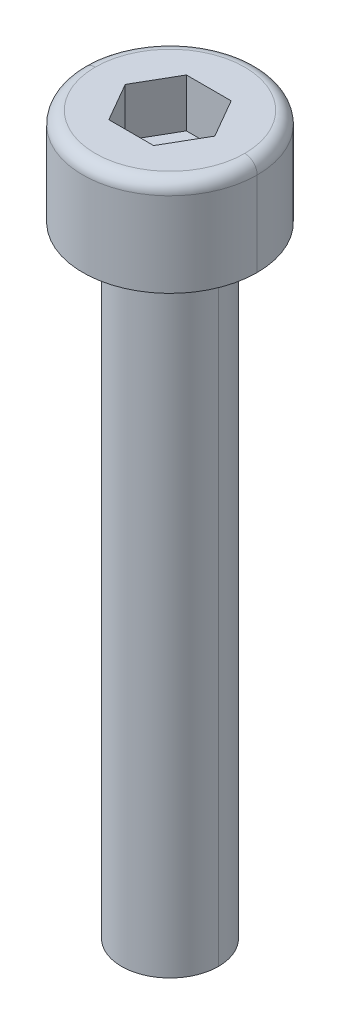
ISO-10303-21;
HEADER;
FILE_DESCRIPTION(('STEP AP214'),'2;1');
FILE_NAME('part.step','',(''),(''),'','','');
FILE_SCHEMA(('AUTOMOTIVE_DESIGN { 1 0 10303 214 1 1 1 1 }'));
ENDSEC;
DATA;
#1=APPLICATION_CONTEXT('core data for automotive mechanical design processes');
#2=APPLICATION_PROTOCOL_DEFINITION('international standard','automotive_design',2000,#1);
#3=PRODUCT_CONTEXT('',#1,'mechanical');
#4=PRODUCT('Part','Part','',(#3));
#5=PRODUCT_RELATED_PRODUCT_CATEGORY('part','',(#4));
#6=PRODUCT_DEFINITION_FORMATION('','',#4);
#7=PRODUCT_DEFINITION_CONTEXT('part definition',#1,'design');
#8=PRODUCT_DEFINITION('design','',#6,#7);
#9=PRODUCT_DEFINITION_SHAPE('','',#8);
#10=(LENGTH_UNIT() NAMED_UNIT(*) SI_UNIT(.MILLI.,.METRE.));
#11=(NAMED_UNIT(*) PLANE_ANGLE_UNIT() SI_UNIT($,.RADIAN.));
#12=(NAMED_UNIT(*) SI_UNIT($,.STERADIAN.) SOLID_ANGLE_UNIT());
#13=UNCERTAINTY_MEASURE_WITH_UNIT(LENGTH_MEASURE(1.E-05),#10,'distance_accuracy_value','');
#14=(GEOMETRIC_REPRESENTATION_CONTEXT(3) GLOBAL_UNCERTAINTY_ASSIGNED_CONTEXT((#13)) GLOBAL_UNIT_ASSIGNED_CONTEXT((#10,
#11,#12)) REPRESENTATION_CONTEXT('',''));
#15=CARTESIAN_POINT('',(0.,0.,0.));
#16=DIRECTION('',(0.,0.,1.));
#17=DIRECTION('',(1.,0.,0.));
#18=AXIS2_PLACEMENT_3D('',#15,#16,#17);
#19=CARTESIAN_POINT('',(0.,-16.,0.));
#20=DIRECTION('',(0.,1.,0.));
#21=DIRECTION('',(1.,0.,0.));
#22=AXIS2_PLACEMENT_3D('',#19,#20,#21);
#23=PLANE('',#22);
#24=CARTESIAN_POINT('',(0.,-16.,0.));
#25=DIRECTION('',(0.,1.,0.));
#26=DIRECTION('',(-1.,0.,0.));
#27=AXIS2_PLACEMENT_3D('',#24,#25,#26);
#28=CIRCLE('',#27,1.25);
#29=CARTESIAN_POINT('',(-1.25,-16.,0.));
#30=VERTEX_POINT('',#29);
#31=CARTESIAN_POINT('',(1.25,-16.,0.));
#32=VERTEX_POINT('',#31);
#33=EDGE_CURVE('E11',#30,#32,#28,.T.);
#34=ORIENTED_EDGE('',*,*,#33,.F.);
#35=CARTESIAN_POINT('',(0.,-16.,0.));
#36=DIRECTION('',(0.,1.,0.));
#37=DIRECTION('',(1.,0.,0.));
#38=AXIS2_PLACEMENT_3D('',#35,#36,#37);
#39=CIRCLE('',#38,1.25);
#40=EDGE_CURVE('E223',#32,#30,#39,.T.);
#41=ORIENTED_EDGE('',*,*,#40,.F.);
#42=EDGE_LOOP('',(#34,#41));
#43=FACE_BOUND('',#42,.T.);
#44=ADVANCED_FACE('F17',(#43),#23,.F.);
#45=CARTESIAN_POINT('',(0.,0.,0.));
#46=DIRECTION('',(0.,1.,0.));
#47=DIRECTION('',(1.,0.,0.));
#48=AXIS2_PLACEMENT_3D('',#45,#46,#47);
#49=CYLINDRICAL_SURFACE('',#48,1.25);
#50=DIRECTION('',(0.,-1.,0.));
#51=VECTOR('',#50,1.);
#52=CARTESIAN_POINT('',(-1.25,0.,0.));
#53=LINE('',#52,#51);
#54=CARTESIAN_POINT('',(-1.25,0.,0.));
#55=VERTEX_POINT('',#54);
#56=EDGE_CURVE('E28',#55,#30,#53,.T.);
#57=ORIENTED_EDGE('',*,*,#56,.T.);
#58=ORIENTED_EDGE('',*,*,#33,.T.);
#59=DIRECTION('',(0.,-1.,0.));
#60=VECTOR('',#59,1.);
#61=CARTESIAN_POINT('',(1.25,0.,0.));
#62=LINE('',#61,#60);
#63=CARTESIAN_POINT('',(1.25,0.,0.));
#64=VERTEX_POINT('',#63);
#65=EDGE_CURVE('E21',#64,#32,#62,.T.);
#66=ORIENTED_EDGE('',*,*,#65,.F.);
#67=CARTESIAN_POINT('',(0.,0.,0.));
#68=DIRECTION('',(0.,1.,0.));
#69=DIRECTION('',(-1.,0.,0.));
#70=AXIS2_PLACEMENT_3D('',#67,#68,#69);
#71=CIRCLE('',#70,1.25);
#72=EDGE_CURVE('E204',#55,#64,#71,.T.);
#73=ORIENTED_EDGE('',*,*,#72,.F.);
#74=EDGE_LOOP('',(#57,#58,#66,#73));
#75=FACE_BOUND('',#74,.T.);
#76=ADVANCED_FACE('F301',(#75),#49,.T.);
#77=CARTESIAN_POINT('',(0.,0.,0.));
#78=DIRECTION('',(0.,1.,0.));
#79=DIRECTION('',(1.,0.,0.));
#80=AXIS2_PLACEMENT_3D('',#77,#78,#79);
#81=CYLINDRICAL_SURFACE('',#80,1.25);
#82=ORIENTED_EDGE('',*,*,#65,.T.);
#83=ORIENTED_EDGE('',*,*,#40,.T.);
#84=ORIENTED_EDGE('',*,*,#56,.F.);
#85=CARTESIAN_POINT('',(0.,0.,0.));
#86=DIRECTION('',(0.,1.,0.));
#87=DIRECTION('',(1.,0.,0.));
#88=AXIS2_PLACEMENT_3D('',#85,#86,#87);
#89=CIRCLE('',#88,1.25);
#90=EDGE_CURVE('E154',#64,#55,#89,.T.);
#91=ORIENTED_EDGE('',*,*,#90,.F.);
#92=EDGE_LOOP('',(#82,#83,#84,#91));
#93=FACE_BOUND('',#92,.T.);
#94=ADVANCED_FACE('F306',(#93),#81,.T.);
#95=CARTESIAN_POINT('',(0.,0.,0.));
#96=DIRECTION('',(0.,1.,0.));
#97=DIRECTION('',(1.,0.,0.));
#98=AXIS2_PLACEMENT_3D('',#95,#96,#97);
#99=CYLINDRICAL_SURFACE('',#98,2.25);
#100=DIRECTION('',(0.,1.,-1.413161317912E-12));
#101=VECTOR('',#100,1.);
#102=CARTESIAN_POINT('',(-2.25,0.,0.));
#103=LINE('',#102,#101);
#104=CARTESIAN_POINT('',(-2.25,0.,0.));
#105=VERTEX_POINT('',#104);
#106=CARTESIAN_POINT('',(-2.25,2.178571428571,0.));
#107=VERTEX_POINT('',#106);
#108=EDGE_CURVE('E228',#105,#107,#103,.T.);
#109=ORIENTED_EDGE('',*,*,#108,.F.);
#110=CARTESIAN_POINT('',(0.,0.,0.));
#111=DIRECTION('',(0.,1.,0.));
#112=DIRECTION('',(-1.,0.,0.));
#113=AXIS2_PLACEMENT_3D('',#110,#111,#112);
#114=CIRCLE('',#113,2.25);
#115=CARTESIAN_POINT('',(2.25,0.,0.));
#116=VERTEX_POINT('',#115);
#117=EDGE_CURVE('E194',#105,#116,#114,.T.);
#118=ORIENTED_EDGE('',*,*,#117,.T.);
#119=DIRECTION('',(0.,1.,1.413056776317E-12));
#120=VECTOR('',#119,1.);
#121=CARTESIAN_POINT('',(2.25,0.,0.));
#122=LINE('',#121,#120);
#123=CARTESIAN_POINT('',(2.25,2.178571428571,0.));
#124=VERTEX_POINT('',#123);
#125=EDGE_CURVE('E232',#116,#124,#122,.T.);
#126=ORIENTED_EDGE('',*,*,#125,.T.);
#127=CARTESIAN_POINT('',(0.,2.178571428571,0.));
#128=DIRECTION('',(0.,1.,0.));
#129=DIRECTION('',(-1.,0.,0.));
#130=AXIS2_PLACEMENT_3D('',#127,#128,#129);
#131=CIRCLE('',#130,2.25);
#132=EDGE_CURVE('E129',#107,#124,#131,.T.);
#133=ORIENTED_EDGE('',*,*,#132,.F.);
#134=EDGE_LOOP('',(#109,#118,#126,#133));
#135=FACE_BOUND('',#134,.T.);
#136=ADVANCED_FACE('F286',(#135),#99,.T.);
#137=CARTESIAN_POINT('',(0.,2.178571428571,0.));
#138=DIRECTION('',(0.,1.,0.));
#139=DIRECTION('',(-0.999910626063819,0.,-0.0133693636595902));
#140=AXIS2_PLACEMENT_3D('',#137,#138,#139);
#141=TOROIDAL_SURFACE('',#140,1.928571428571,0.3214285714286);
#142=CARTESIAN_POINT('',(-1.928571428571,2.178571428571,0.));
#143=DIRECTION('',(0.,0.,1.));
#144=DIRECTION('',(0.,1.,0.));
#145=AXIS2_PLACEMENT_3D('',#142,#143,#144);
#146=CIRCLE('',#145,0.3214285714286);
#147=CARTESIAN_POINT('',(-1.928571387235,2.5,0.));
#148=VERTEX_POINT('',#147);
#149=EDGE_CURVE('E227',#148,#107,#146,.T.);
#150=ORIENTED_EDGE('',*,*,#149,.T.);
#151=ORIENTED_EDGE('',*,*,#132,.T.);
#152=CARTESIAN_POINT('',(1.928571428571,2.178571428571,0.));
#153=DIRECTION('',(0.,0.,-1.));
#154=DIRECTION('',(0.,1.,0.));
#155=AXIS2_PLACEMENT_3D('',#152,#153,#154);
#156=CIRCLE('',#155,0.3214285714286);
#157=CARTESIAN_POINT('',(1.928571387235,2.5,0.));
#158=VERTEX_POINT('',#157);
#159=EDGE_CURVE('E175',#158,#124,#156,.T.);
#160=ORIENTED_EDGE('',*,*,#159,.F.);
#161=CARTESIAN_POINT('',(0.,2.5,0.));
#162=DIRECTION('',(0.,1.,0.));
#163=DIRECTION('',(-1.,0.,0.));
#164=AXIS2_PLACEMENT_3D('',#161,#162,#163);
#165=CIRCLE('',#164,1.928571387235);
#166=EDGE_CURVE('E180',#148,#158,#165,.T.);
#167=ORIENTED_EDGE('',*,*,#166,.F.);
#168=EDGE_LOOP('',(#150,#151,#160,#167));
#169=FACE_BOUND('',#168,.T.);
#170=ADVANCED_FACE('F281',(#169),#141,.T.);
#171=CARTESIAN_POINT('',(0.,1.25,0.));
#172=DIRECTION('',(0.,1.,0.));
#173=DIRECTION('',(1.,0.,0.));
#174=AXIS2_PLACEMENT_3D('',#171,#172,#173);
#175=PLANE('',#174);
#176=DIRECTION('',(0.500000000000017,0.,-0.866025403784429));
#177=VECTOR('',#176,1.);
#178=CARTESIAN_POINT('',(0.5773502691896,1.25,1.));
#179=LINE('',#178,#177);
#180=CARTESIAN_POINT('',(0.5773502691896,1.25,1.));
#181=VERTEX_POINT('',#180);
#182=CARTESIAN_POINT('',(1.154700538379,1.25,0.));
#183=VERTEX_POINT('',#182);
#184=EDGE_CURVE('E117',#181,#183,#179,.T.);
#185=ORIENTED_EDGE('',*,*,#184,.T.);
#186=DIRECTION('',(-0.500000000000017,0.,-0.866025403784429));
#187=VECTOR('',#186,1.);
#188=CARTESIAN_POINT('',(1.154700538379,1.25,0.));
#189=LINE('',#188,#187);
#190=CARTESIAN_POINT('',(0.5773502691896,1.25,-1.));
#191=VERTEX_POINT('',#190);
#192=EDGE_CURVE('E189',#183,#191,#189,.T.);
#193=ORIENTED_EDGE('',*,*,#192,.T.);
#194=DIRECTION('',(-1.,0.,0.));
#195=VECTOR('',#194,1.);
#196=CARTESIAN_POINT('',(0.5773502691896,1.25,-1.));
#197=LINE('',#196,#195);
#198=CARTESIAN_POINT('',(-0.5773502691896,1.25,-1.));
#199=VERTEX_POINT('',#198);
#200=EDGE_CURVE('E190',#191,#199,#197,.T.);
#201=ORIENTED_EDGE('',*,*,#200,.T.);
#202=DIRECTION('',(-0.500000000000017,0.,0.866025403784429));
#203=VECTOR('',#202,1.);
#204=CARTESIAN_POINT('',(-0.5773502691896,1.25,-1.));
#205=LINE('',#204,#203);
#206=CARTESIAN_POINT('',(-1.154700538379,1.25,0.));
#207=VERTEX_POINT('',#206);
#208=EDGE_CURVE('E179',#199,#207,#205,.T.);
#209=ORIENTED_EDGE('',*,*,#208,.T.);
#210=DIRECTION('',(0.500000000000017,0.,0.866025403784429));
#211=VECTOR('',#210,1.);
#212=CARTESIAN_POINT('',(-1.154700538379,1.25,0.));
#213=LINE('',#212,#211);
#214=CARTESIAN_POINT('',(-0.5773502691896,1.25,1.));
#215=VERTEX_POINT('',#214);
#216=EDGE_CURVE('E135',#207,#215,#213,.T.);
#217=ORIENTED_EDGE('',*,*,#216,.T.);
#218=DIRECTION('',(1.,0.,0.));
#219=VECTOR('',#218,1.);
#220=CARTESIAN_POINT('',(-0.5773502691896,1.25,1.));
#221=LINE('',#220,#219);
#222=EDGE_CURVE('E132',#215,#181,#221,.T.);
#223=ORIENTED_EDGE('',*,*,#222,.T.);
#224=EDGE_LOOP('',(#185,#193,#201,#209,#217,#223));
#225=FACE_BOUND('',#224,.T.);
#226=ADVANCED_FACE('F133',(#225),#175,.T.);
#227=CARTESIAN_POINT('',(0.5773502691896,2.5,1.));
#228=DIRECTION('',(0.866025403784429,0.,0.500000000000017));
#229=DIRECTION('',(0.,-1.,0.));
#230=AXIS2_PLACEMENT_3D('',#227,#228,#229);
#231=PLANE('',#230);
#232=DIRECTION('',(0.,-1.,0.));
#233=VECTOR('',#232,1.);
#234=CARTESIAN_POINT('',(1.154700538379,2.5,0.));
#235=LINE('',#234,#233);
#236=CARTESIAN_POINT('',(1.154700538379,2.5,0.));
#237=VERTEX_POINT('',#236);
#238=EDGE_CURVE('E124',#237,#183,#235,.T.);
#239=ORIENTED_EDGE('',*,*,#238,.T.);
#240=ORIENTED_EDGE('',*,*,#184,.F.);
#241=DIRECTION('',(0.,-1.,0.));
#242=VECTOR('',#241,1.);
#243=CARTESIAN_POINT('',(0.5773502691896,2.5,1.));
#244=LINE('',#243,#242);
#245=CARTESIAN_POINT('',(0.5773502691896,2.5,1.));
#246=VERTEX_POINT('',#245);
#247=EDGE_CURVE('E122',#246,#181,#244,.T.);
#248=ORIENTED_EDGE('',*,*,#247,.F.);
#249=DIRECTION('',(0.500000000000017,0.,-0.866025403784429));
#250=VECTOR('',#249,1.);
#251=CARTESIAN_POINT('',(0.5773502691896,2.5,1.));
#252=LINE('',#251,#250);
#253=EDGE_CURVE('E151',#246,#237,#252,.T.);
#254=ORIENTED_EDGE('',*,*,#253,.T.);
#255=EDGE_LOOP('',(#239,#240,#248,#254));
#256=FACE_BOUND('',#255,.T.);
#257=ADVANCED_FACE('F119',(#256),#231,.F.);
#258=CARTESIAN_POINT('',(1.154700538379,2.5,0.));
#259=DIRECTION('',(0.866025403784429,0.,-0.500000000000017));
#260=DIRECTION('',(0.,-1.,0.));
#261=AXIS2_PLACEMENT_3D('',#258,#259,#260);
#262=PLANE('',#261);
#263=DIRECTION('',(0.,-1.,0.));
#264=VECTOR('',#263,1.);
#265=CARTESIAN_POINT('',(0.5773502691896,2.5,-1.));
#266=LINE('',#265,#264);
#267=CARTESIAN_POINT('',(0.5773502691896,2.5,-1.));
#268=VERTEX_POINT('',#267);
#269=EDGE_CURVE('E186',#268,#191,#266,.T.);
#270=ORIENTED_EDGE('',*,*,#269,.T.);
#271=ORIENTED_EDGE('',*,*,#192,.F.);
#272=ORIENTED_EDGE('',*,*,#238,.F.);
#273=DIRECTION('',(-0.500000000000017,0.,-0.866025403784429));
#274=VECTOR('',#273,1.);
#275=CARTESIAN_POINT('',(1.154700538379,2.5,0.));
#276=LINE('',#275,#274);
#277=EDGE_CURVE('E155',#237,#268,#276,.T.);
#278=ORIENTED_EDGE('',*,*,#277,.T.);
#279=EDGE_LOOP('',(#270,#271,#272,#278));
#280=FACE_BOUND('',#279,.T.);
#281=ADVANCED_FACE('F259',(#280),#262,.F.);
#282=CARTESIAN_POINT('',(0.5773502691896,2.5,-1.));
#283=DIRECTION('',(0.,0.,-1.));
#284=DIRECTION('',(0.,-1.,0.));
#285=AXIS2_PLACEMENT_3D('',#282,#283,#284);
#286=PLANE('',#285);
#287=DIRECTION('',(0.,-1.,0.));
#288=VECTOR('',#287,1.);
#289=CARTESIAN_POINT('',(-0.5773502691896,2.5,-1.));
#290=LINE('',#289,#288);
#291=CARTESIAN_POINT('',(-0.5773502691896,2.5,-1.));
#292=VERTEX_POINT('',#291);
#293=EDGE_CURVE('E193',#292,#199,#290,.T.);
#294=ORIENTED_EDGE('',*,*,#293,.T.);
#295=ORIENTED_EDGE('',*,*,#200,.F.);
#296=ORIENTED_EDGE('',*,*,#269,.F.);
#297=DIRECTION('',(-1.,0.,0.));
#298=VECTOR('',#297,1.);
#299=CARTESIAN_POINT('',(0.5773502691896,2.5,-1.));
#300=LINE('',#299,#298);
#301=EDGE_CURVE('E161',#268,#292,#300,.T.);
#302=ORIENTED_EDGE('',*,*,#301,.T.);
#303=EDGE_LOOP('',(#294,#295,#296,#302));
#304=FACE_BOUND('',#303,.T.);
#305=ADVANCED_FACE('F261',(#304),#286,.F.);
#306=CARTESIAN_POINT('',(-0.5773502691896,2.5,-1.));
#307=DIRECTION('',(-0.866025403784429,0.,-0.500000000000017));
#308=DIRECTION('',(-0.500000000000017,0.,0.866025403784429));
#309=AXIS2_PLACEMENT_3D('',#306,#307,#308);
#310=PLANE('',#309);
#311=DIRECTION('',(0.,-1.,0.));
#312=VECTOR('',#311,1.);
#313=CARTESIAN_POINT('',(-1.154700538379,2.5,0.));
#314=LINE('',#313,#312);
#315=CARTESIAN_POINT('',(-1.154700538379,2.5,0.));
#316=VERTEX_POINT('',#315);
#317=EDGE_CURVE('E176',#316,#207,#314,.T.);
#318=ORIENTED_EDGE('',*,*,#317,.T.);
#319=ORIENTED_EDGE('',*,*,#208,.F.);
#320=ORIENTED_EDGE('',*,*,#293,.F.);
#321=DIRECTION('',(-0.500000000000017,0.,0.866025403784429));
#322=VECTOR('',#321,1.);
#323=CARTESIAN_POINT('',(-0.5773502691896,2.5,-1.));
#324=LINE('',#323,#322);
#325=EDGE_CURVE('E171',#292,#316,#324,.T.);
#326=ORIENTED_EDGE('',*,*,#325,.T.);
#327=EDGE_LOOP('',(#318,#319,#320,#326));
#328=FACE_BOUND('',#327,.T.);
#329=ADVANCED_FACE('F265',(#328),#310,.F.);
#330=CARTESIAN_POINT('',(-1.154700538379,2.5,0.));
#331=DIRECTION('',(-0.866025403784429,0.,0.500000000000017));
#332=DIRECTION('',(0.,1.,0.));
#333=AXIS2_PLACEMENT_3D('',#330,#331,#332);
#334=PLANE('',#333);
#335=DIRECTION('',(0.,-1.,0.));
#336=VECTOR('',#335,1.);
#337=CARTESIAN_POINT('',(-0.5773502691896,2.5,1.));
#338=LINE('',#337,#336);
#339=CARTESIAN_POINT('',(-0.5773502691896,2.5,1.));
#340=VERTEX_POINT('',#339);
#341=EDGE_CURVE('E139',#340,#215,#338,.T.);
#342=ORIENTED_EDGE('',*,*,#341,.T.);
#343=ORIENTED_EDGE('',*,*,#216,.F.);
#344=ORIENTED_EDGE('',*,*,#317,.F.);
#345=DIRECTION('',(0.500000000000017,0.,0.866025403784429));
#346=VECTOR('',#345,1.);
#347=CARTESIAN_POINT('',(-1.154700538379,2.5,0.));
#348=LINE('',#347,#346);
#349=EDGE_CURVE('E184',#316,#340,#348,.T.);
#350=ORIENTED_EDGE('',*,*,#349,.T.);
#351=EDGE_LOOP('',(#342,#343,#344,#350));
#352=FACE_BOUND('',#351,.T.);
#353=ADVANCED_FACE('F268',(#352),#334,.F.);
#354=CARTESIAN_POINT('',(-0.5773502691896,2.5,1.));
#355=DIRECTION('',(0.,0.,1.));
#356=DIRECTION('',(1.,0.,0.));
#357=AXIS2_PLACEMENT_3D('',#354,#355,#356);
#358=PLANE('',#357);
#359=ORIENTED_EDGE('',*,*,#247,.T.);
#360=ORIENTED_EDGE('',*,*,#222,.F.);
#361=ORIENTED_EDGE('',*,*,#341,.F.);
#362=DIRECTION('',(1.,0.,0.));
#363=VECTOR('',#362,1.);
#364=CARTESIAN_POINT('',(-0.5773502691896,2.5,1.));
#365=LINE('',#364,#363);
#366=EDGE_CURVE('E143',#340,#246,#365,.T.);
#367=ORIENTED_EDGE('',*,*,#366,.T.);
#368=EDGE_LOOP('',(#359,#360,#361,#367));
#369=FACE_BOUND('',#368,.T.);
#370=ADVANCED_FACE('F141',(#369),#358,.F.);
#371=CARTESIAN_POINT('',(0.,2.5,0.));
#372=DIRECTION('',(0.,1.,0.));
#373=DIRECTION('',(1.,0.,0.));
#374=AXIS2_PLACEMENT_3D('',#371,#372,#373);
#375=PLANE('',#374);
#376=ORIENTED_EDGE('',*,*,#349,.F.);
#377=ORIENTED_EDGE('',*,*,#325,.F.);
#378=ORIENTED_EDGE('',*,*,#301,.F.);
#379=ORIENTED_EDGE('',*,*,#277,.F.);
#380=ORIENTED_EDGE('',*,*,#253,.F.);
#381=ORIENTED_EDGE('',*,*,#366,.F.);
#382=EDGE_LOOP('',(#376,#377,#378,#379,#380,#381));
#383=FACE_BOUND('',#382,.T.);
#384=ORIENTED_EDGE('',*,*,#166,.T.);
#385=CARTESIAN_POINT('',(0.,2.5,0.));
#386=DIRECTION('',(0.,1.,0.));
#387=DIRECTION('',(1.,0.,0.));
#388=AXIS2_PLACEMENT_3D('',#385,#386,#387);
#389=CIRCLE('',#388,1.928571387235);
#390=EDGE_CURVE('E185',#158,#148,#389,.T.);
#391=ORIENTED_EDGE('',*,*,#390,.T.);
#392=EDGE_LOOP('',(#384,#391));
#393=FACE_BOUND('',#392,.T.);
#394=ADVANCED_FACE('F19',(#383,#393),#375,.T.);
#395=CARTESIAN_POINT('',(0.,2.178571428571,0.));
#396=DIRECTION('',(0.,1.,0.));
#397=DIRECTION('',(0.999910626063819,0.,0.0133693636595902));
#398=AXIS2_PLACEMENT_3D('',#395,#396,#397);
#399=TOROIDAL_SURFACE('',#398,1.928571428571,0.3214285714286);
#400=ORIENTED_EDGE('',*,*,#159,.T.);
#401=CARTESIAN_POINT('',(0.,2.178571428571,0.));
#402=DIRECTION('',(0.,1.,0.));
#403=DIRECTION('',(1.,0.,0.));
#404=AXIS2_PLACEMENT_3D('',#401,#402,#403);
#405=CIRCLE('',#404,2.25);
#406=EDGE_CURVE('E231',#124,#107,#405,.T.);
#407=ORIENTED_EDGE('',*,*,#406,.T.);
#408=ORIENTED_EDGE('',*,*,#149,.F.);
#409=ORIENTED_EDGE('',*,*,#390,.F.);
#410=EDGE_LOOP('',(#400,#407,#408,#409));
#411=FACE_BOUND('',#410,.T.);
#412=ADVANCED_FACE('F272',(#411),#399,.T.);
#413=CARTESIAN_POINT('',(0.,0.,0.));
#414=DIRECTION('',(0.,1.,0.));
#415=DIRECTION('',(1.,0.,0.));
#416=AXIS2_PLACEMENT_3D('',#413,#414,#415);
#417=CYLINDRICAL_SURFACE('',#416,2.25);
#418=ORIENTED_EDGE('',*,*,#125,.F.);
#419=CARTESIAN_POINT('',(0.,0.,0.));
#420=DIRECTION('',(0.,1.,0.));
#421=DIRECTION('',(1.,0.,0.));
#422=AXIS2_PLACEMENT_3D('',#419,#420,#421);
#423=CIRCLE('',#422,2.25);
#424=EDGE_CURVE('E197',#116,#105,#423,.T.);
#425=ORIENTED_EDGE('',*,*,#424,.T.);
#426=ORIENTED_EDGE('',*,*,#108,.T.);
#427=ORIENTED_EDGE('',*,*,#406,.F.);
#428=EDGE_LOOP('',(#418,#425,#426,#427));
#429=FACE_BOUND('',#428,.T.);
#430=ADVANCED_FACE('F287',(#429),#417,.T.);
#431=CARTESIAN_POINT('',(0.,0.,0.));
#432=DIRECTION('',(0.,1.,0.));
#433=DIRECTION('',(1.,0.,0.));
#434=AXIS2_PLACEMENT_3D('',#431,#432,#433);
#435=PLANE('',#434);
#436=ORIENTED_EDGE('',*,*,#72,.T.);
#437=ORIENTED_EDGE('',*,*,#90,.T.);
#438=EDGE_LOOP('',(#436,#437));
#439=FACE_BOUND('',#438,.T.);
#440=ORIENTED_EDGE('',*,*,#117,.F.);
#441=ORIENTED_EDGE('',*,*,#424,.F.);
#442=EDGE_LOOP('',(#440,#441));
#443=FACE_BOUND('',#442,.T.);
#444=ADVANCED_FACE('F289',(#439,#443),#435,.F.);
#445=CLOSED_SHELL('',(#44,#76,#94,#136,#170,#226,#257,#281,#305,#329,#353,#370,#394,#412,#430,#444));
#446=MANIFOLD_SOLID_BREP('B1',#445);
#447=ADVANCED_BREP_SHAPE_REPRESENTATION('',(#18,#446),#14);
#448=SHAPE_DEFINITION_REPRESENTATION(#9,#447);
ENDSEC;
END-ISO-10303-21;
